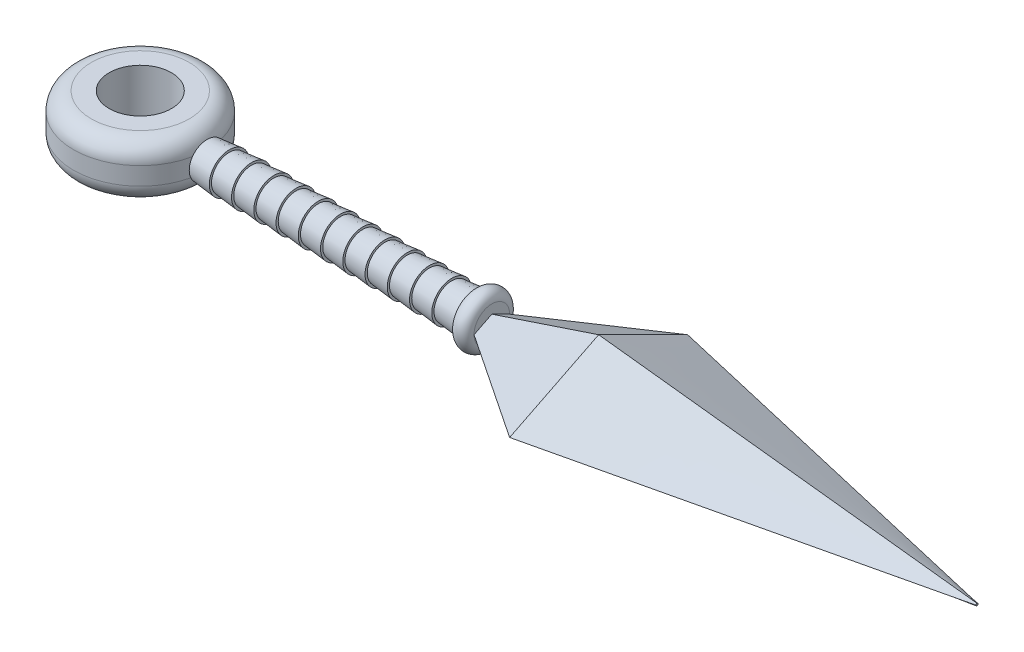
ISO-10303-21;
HEADER;
FILE_DESCRIPTION(('STEP AP214'),'2;1');
FILE_NAME('part.step','',(''),(''),'','','');
FILE_SCHEMA(('AUTOMOTIVE_DESIGN { 1 0 10303 214 1 1 1 1 }'));
ENDSEC;
DATA;
#1=APPLICATION_CONTEXT('core data for automotive mechanical design processes');
#2=APPLICATION_PROTOCOL_DEFINITION('international standard','automotive_design',2000,#1);
#3=PRODUCT_CONTEXT('',#1,'mechanical');
#4=PRODUCT('Part','Part','',(#3));
#5=PRODUCT_RELATED_PRODUCT_CATEGORY('part','',(#4));
#6=PRODUCT_DEFINITION_FORMATION('','',#4);
#7=PRODUCT_DEFINITION_CONTEXT('part definition',#1,'design');
#8=PRODUCT_DEFINITION('design','',#6,#7);
#9=PRODUCT_DEFINITION_SHAPE('','',#8);
#10=(LENGTH_UNIT() NAMED_UNIT(*) SI_UNIT(.MILLI.,.METRE.));
#11=(NAMED_UNIT(*) PLANE_ANGLE_UNIT() SI_UNIT($,.RADIAN.));
#12=(NAMED_UNIT(*) SI_UNIT($,.STERADIAN.) SOLID_ANGLE_UNIT());
#13=UNCERTAINTY_MEASURE_WITH_UNIT(LENGTH_MEASURE(1.E-05),#10,'distance_accuracy_value','');
#14=(GEOMETRIC_REPRESENTATION_CONTEXT(3) GLOBAL_UNCERTAINTY_ASSIGNED_CONTEXT((#13)) GLOBAL_UNIT_ASSIGNED_CONTEXT((#10,
#11,#12)) REPRESENTATION_CONTEXT('',''));
#15=CARTESIAN_POINT('',(0.,0.,0.));
#16=DIRECTION('',(0.,0.,1.));
#17=DIRECTION('',(1.,0.,0.));
#18=AXIS2_PLACEMENT_3D('',#15,#16,#17);
#19=CARTESIAN_POINT('',(75.,0.,0.));
#20=DIRECTION('',(-1.,0.,0.));
#21=DIRECTION('',(0.,0.,1.));
#22=AXIS2_PLACEMENT_3D('',#19,#20,#21);
#23=PLANE('',#22);
#24=CARTESIAN_POINT('',(75.,0.,0.));
#25=DIRECTION('',(-1.,0.,0.));
#26=DIRECTION('',(0.,0.,1.));
#27=AXIS2_PLACEMENT_3D('',#24,#25,#26);
#28=CIRCLE('',#27,4.5);
#29=CARTESIAN_POINT('',(75.,0.,4.5));
#30=VERTEX_POINT('',#29);
#31=EDGE_CURVE('E12',#30,#30,#28,.T.);
#32=ORIENTED_EDGE('',*,*,#31,.F.);
#33=EDGE_LOOP('',(#32));
#34=FACE_BOUND('',#33,.T.);
#35=ADVANCED_FACE('F81',(#34),#23,.F.);
#36=CARTESIAN_POINT('',(75.,0.,0.));
#37=DIRECTION('',(1.,0.,0.));
#38=DIRECTION('',(0.,0.,-1.));
#39=AXIS2_PLACEMENT_3D('',#36,#37,#38);
#40=CONICAL_SURFACE('',#39,4.5,0.0996686524911619);
#41=CARTESIAN_POINT('',(70.,0.,0.));
#42=DIRECTION('',(-1.,0.,0.));
#43=DIRECTION('',(0.,0.,1.));
#44=AXIS2_PLACEMENT_3D('',#41,#42,#43);
#45=CIRCLE('',#44,4.);
#46=CARTESIAN_POINT('',(70.,0.,4.));
#47=VERTEX_POINT('',#46);
#48=EDGE_CURVE('E89',#47,#47,#45,.T.);
#49=ORIENTED_EDGE('',*,*,#48,.F.);
#50=EDGE_LOOP('',(#49));
#51=FACE_BOUND('',#50,.T.);
#52=ORIENTED_EDGE('',*,*,#31,.T.);
#53=EDGE_LOOP('',(#52));
#54=FACE_BOUND('',#53,.T.);
#55=ADVANCED_FACE('F98',(#51,#54),#40,.T.);
#56=CARTESIAN_POINT('',(70.,4.,0.));
#57=DIRECTION('',(1.,0.,0.));
#58=DIRECTION('',(0.,0.,-1.));
#59=AXIS2_PLACEMENT_3D('',#56,#57,#58);
#60=PLANE('',#59);
#61=ORIENTED_EDGE('',*,*,#48,.T.);
#62=EDGE_LOOP('',(#61));
#63=FACE_BOUND('',#62,.T.);
#64=ADVANCED_FACE('F96',(#63),#60,.F.);
#65=CLOSED_SHELL('',(#35,#55,#64));
#66=MANIFOLD_SOLID_BREP('B2',#65);
#67=CARTESIAN_POINT('',(70.,0.,0.));
#68=DIRECTION('',(-1.,0.,0.));
#69=DIRECTION('',(0.,0.,1.));
#70=AXIS2_PLACEMENT_3D('',#67,#68,#69);
#71=PLANE('',#70);
#72=CARTESIAN_POINT('',(70.,0.,0.));
#73=DIRECTION('',(-1.,0.,0.));
#74=DIRECTION('',(0.,0.,1.));
#75=AXIS2_PLACEMENT_3D('',#72,#73,#74);
#76=CIRCLE('',#75,4.5);
#77=CARTESIAN_POINT('',(70.,0.,4.5));
#78=VERTEX_POINT('',#77);
#79=EDGE_CURVE('E85',#78,#78,#76,.T.);
#80=ORIENTED_EDGE('',*,*,#79,.F.);
#81=EDGE_LOOP('',(#80));
#82=FACE_BOUND('',#81,.T.);
#83=ADVANCED_FACE('F132',(#82),#71,.F.);
#84=CARTESIAN_POINT('',(70.,0.,0.));
#85=DIRECTION('',(1.,0.,0.));
#86=DIRECTION('',(0.,0.,-1.));
#87=AXIS2_PLACEMENT_3D('',#84,#85,#86);
#88=CONICAL_SURFACE('',#87,4.5,0.0996686524911619);
#89=CARTESIAN_POINT('',(65.,0.,0.));
#90=DIRECTION('',(-1.,0.,0.));
#91=DIRECTION('',(0.,0.,1.));
#92=AXIS2_PLACEMENT_3D('',#89,#90,#91);
#93=CIRCLE('',#92,4.);
#94=CARTESIAN_POINT('',(65.,0.,4.));
#95=VERTEX_POINT('',#94);
#96=EDGE_CURVE('E136',#95,#95,#93,.T.);
#97=ORIENTED_EDGE('',*,*,#96,.F.);
#98=EDGE_LOOP('',(#97));
#99=FACE_BOUND('',#98,.T.);
#100=ORIENTED_EDGE('',*,*,#79,.T.);
#101=EDGE_LOOP('',(#100));
#102=FACE_BOUND('',#101,.T.);
#103=ADVANCED_FACE('F150',(#99,#102),#88,.T.);
#104=CARTESIAN_POINT('',(65.,4.,0.));
#105=DIRECTION('',(1.,0.,0.));
#106=DIRECTION('',(0.,0.,-1.));
#107=AXIS2_PLACEMENT_3D('',#104,#105,#106);
#108=PLANE('',#107);
#109=ORIENTED_EDGE('',*,*,#96,.T.);
#110=EDGE_LOOP('',(#109));
#111=FACE_BOUND('',#110,.T.);
#112=ADVANCED_FACE('F144',(#111),#108,.F.);
#113=CLOSED_SHELL('',(#83,#103,#112));
#114=MANIFOLD_SOLID_BREP('B7',#113);
#115=CARTESIAN_POINT('',(65.,0.,0.));
#116=DIRECTION('',(-1.,0.,0.));
#117=DIRECTION('',(0.,0.,1.));
#118=AXIS2_PLACEMENT_3D('',#115,#116,#117);
#119=PLANE('',#118);
#120=CARTESIAN_POINT('',(65.,0.,0.));
#121=DIRECTION('',(-1.,0.,0.));
#122=DIRECTION('',(0.,0.,1.));
#123=AXIS2_PLACEMENT_3D('',#120,#121,#122);
#124=CIRCLE('',#123,4.5);
#125=CARTESIAN_POINT('',(65.,0.,4.5));
#126=VERTEX_POINT('',#125);
#127=EDGE_CURVE('E134',#126,#126,#124,.T.);
#128=ORIENTED_EDGE('',*,*,#127,.F.);
#129=EDGE_LOOP('',(#128));
#130=FACE_BOUND('',#129,.T.);
#131=ADVANCED_FACE('F185',(#130),#119,.F.);
#132=CARTESIAN_POINT('',(65.,0.,0.));
#133=DIRECTION('',(1.,0.,0.));
#134=DIRECTION('',(0.,0.,-1.));
#135=AXIS2_PLACEMENT_3D('',#132,#133,#134);
#136=CONICAL_SURFACE('',#135,4.5,0.0996686524911619);
#137=CARTESIAN_POINT('',(60.,0.,0.));
#138=DIRECTION('',(-1.,0.,0.));
#139=DIRECTION('',(0.,0.,1.));
#140=AXIS2_PLACEMENT_3D('',#137,#138,#139);
#141=CIRCLE('',#140,4.);
#142=CARTESIAN_POINT('',(60.,0.,4.));
#143=VERTEX_POINT('',#142);
#144=EDGE_CURVE('E187',#143,#143,#141,.T.);
#145=ORIENTED_EDGE('',*,*,#144,.F.);
#146=EDGE_LOOP('',(#145));
#147=FACE_BOUND('',#146,.T.);
#148=ORIENTED_EDGE('',*,*,#127,.T.);
#149=EDGE_LOOP('',(#148));
#150=FACE_BOUND('',#149,.T.);
#151=ADVANCED_FACE('F198',(#147,#150),#136,.T.);
#152=CARTESIAN_POINT('',(60.,4.,0.));
#153=DIRECTION('',(1.,0.,0.));
#154=DIRECTION('',(0.,0.,-1.));
#155=AXIS2_PLACEMENT_3D('',#152,#153,#154);
#156=PLANE('',#155);
#157=ORIENTED_EDGE('',*,*,#144,.T.);
#158=EDGE_LOOP('',(#157));
#159=FACE_BOUND('',#158,.T.);
#160=ADVANCED_FACE('F191',(#159),#156,.F.);
#161=CLOSED_SHELL('',(#131,#151,#160));
#162=MANIFOLD_SOLID_BREP('B77',#161);
#163=CARTESIAN_POINT('',(60.,0.,0.));
#164=DIRECTION('',(-1.,0.,0.));
#165=DIRECTION('',(0.,0.,1.));
#166=AXIS2_PLACEMENT_3D('',#163,#164,#165);
#167=PLANE('',#166);
#168=CARTESIAN_POINT('',(60.,0.,0.));
#169=DIRECTION('',(-1.,0.,0.));
#170=DIRECTION('',(0.,0.,1.));
#171=AXIS2_PLACEMENT_3D('',#168,#169,#170);
#172=CIRCLE('',#171,4.5);
#173=CARTESIAN_POINT('',(60.,0.,4.5));
#174=VERTEX_POINT('',#173);
#175=EDGE_CURVE('E182',#174,#174,#172,.T.);
#176=ORIENTED_EDGE('',*,*,#175,.F.);
#177=EDGE_LOOP('',(#176));
#178=FACE_BOUND('',#177,.T.);
#179=ADVANCED_FACE('F232',(#178),#167,.F.);
#180=CARTESIAN_POINT('',(60.,0.,0.));
#181=DIRECTION('',(1.,0.,0.));
#182=DIRECTION('',(0.,0.,-1.));
#183=AXIS2_PLACEMENT_3D('',#180,#181,#182);
#184=CONICAL_SURFACE('',#183,4.5,0.0996686524911619);
#185=CARTESIAN_POINT('',(55.,0.,0.));
#186=DIRECTION('',(-1.,0.,0.));
#187=DIRECTION('',(0.,0.,1.));
#188=AXIS2_PLACEMENT_3D('',#185,#186,#187);
#189=CIRCLE('',#188,4.);
#190=CARTESIAN_POINT('',(55.,0.,4.));
#191=VERTEX_POINT('',#190);
#192=EDGE_CURVE('E240',#191,#191,#189,.T.);
#193=ORIENTED_EDGE('',*,*,#192,.F.);
#194=EDGE_LOOP('',(#193));
#195=FACE_BOUND('',#194,.T.);
#196=ORIENTED_EDGE('',*,*,#175,.T.);
#197=EDGE_LOOP('',(#196));
#198=FACE_BOUND('',#197,.T.);
#199=ADVANCED_FACE('F241',(#195,#198),#184,.T.);
#200=CARTESIAN_POINT('',(55.,4.,0.));
#201=DIRECTION('',(1.,0.,0.));
#202=DIRECTION('',(0.,0.,-1.));
#203=AXIS2_PLACEMENT_3D('',#200,#201,#202);
#204=PLANE('',#203);
#205=ORIENTED_EDGE('',*,*,#192,.T.);
#206=EDGE_LOOP('',(#205));
#207=FACE_BOUND('',#206,.T.);
#208=ADVANCED_FACE('F242',(#207),#204,.F.);
#209=CLOSED_SHELL('',(#179,#199,#208));
#210=MANIFOLD_SOLID_BREP('B130',#209);
#211=CARTESIAN_POINT('',(55.,0.,0.));
#212=DIRECTION('',(-1.,0.,0.));
#213=DIRECTION('',(0.,0.,1.));
#214=AXIS2_PLACEMENT_3D('',#211,#212,#213);
#215=PLANE('',#214);
#216=CARTESIAN_POINT('',(55.,0.,0.));
#217=DIRECTION('',(-1.,0.,0.));
#218=DIRECTION('',(0.,0.,1.));
#219=AXIS2_PLACEMENT_3D('',#216,#217,#218);
#220=CIRCLE('',#219,4.5);
#221=CARTESIAN_POINT('',(55.,0.,4.5));
#222=VERTEX_POINT('',#221);
#223=EDGE_CURVE('E226',#222,#222,#220,.T.);
#224=ORIENTED_EDGE('',*,*,#223,.F.);
#225=EDGE_LOOP('',(#224));
#226=FACE_BOUND('',#225,.T.);
#227=ADVANCED_FACE('F278',(#226),#215,.F.);
#228=CARTESIAN_POINT('',(55.,0.,0.));
#229=DIRECTION('',(1.,0.,0.));
#230=DIRECTION('',(0.,0.,-1.));
#231=AXIS2_PLACEMENT_3D('',#228,#229,#230);
#232=CONICAL_SURFACE('',#231,4.5,0.0996686524911619);
#233=CARTESIAN_POINT('',(50.,0.,0.));
#234=DIRECTION('',(-1.,0.,0.));
#235=DIRECTION('',(0.,0.,1.));
#236=AXIS2_PLACEMENT_3D('',#233,#234,#235);
#237=CIRCLE('',#236,4.);
#238=CARTESIAN_POINT('',(50.,0.,4.));
#239=VERTEX_POINT('',#238);
#240=EDGE_CURVE('E287',#239,#239,#237,.T.);
#241=ORIENTED_EDGE('',*,*,#240,.F.);
#242=EDGE_LOOP('',(#241));
#243=FACE_BOUND('',#242,.T.);
#244=ORIENTED_EDGE('',*,*,#223,.T.);
#245=EDGE_LOOP('',(#244));
#246=FACE_BOUND('',#245,.T.);
#247=ADVANCED_FACE('F294',(#243,#246),#232,.T.);
#248=CARTESIAN_POINT('',(50.,4.,0.));
#249=DIRECTION('',(1.,0.,0.));
#250=DIRECTION('',(0.,0.,-1.));
#251=AXIS2_PLACEMENT_3D('',#248,#249,#250);
#252=PLANE('',#251);
#253=ORIENTED_EDGE('',*,*,#240,.T.);
#254=EDGE_LOOP('',(#253));
#255=FACE_BOUND('',#254,.T.);
#256=ADVANCED_FACE('F295',(#255),#252,.F.);
#257=CLOSED_SHELL('',(#227,#247,#256));
#258=MANIFOLD_SOLID_BREP('B177',#257);
#259=CARTESIAN_POINT('',(50.,0.,0.));
#260=DIRECTION('',(-1.,0.,0.));
#261=DIRECTION('',(0.,0.,1.));
#262=AXIS2_PLACEMENT_3D('',#259,#260,#261);
#263=PLANE('',#262);
#264=CARTESIAN_POINT('',(50.,0.,0.));
#265=DIRECTION('',(-1.,0.,0.));
#266=DIRECTION('',(0.,0.,1.));
#267=AXIS2_PLACEMENT_3D('',#264,#265,#266);
#268=CIRCLE('',#267,4.5);
#269=CARTESIAN_POINT('',(50.,0.,4.5));
#270=VERTEX_POINT('',#269);
#271=EDGE_CURVE('E276',#270,#270,#268,.T.);
#272=ORIENTED_EDGE('',*,*,#271,.F.);
#273=EDGE_LOOP('',(#272));
#274=FACE_BOUND('',#273,.T.);
#275=ADVANCED_FACE('F328',(#274),#263,.F.);
#276=CARTESIAN_POINT('',(50.,0.,0.));
#277=DIRECTION('',(1.,0.,0.));
#278=DIRECTION('',(0.,0.,-1.));
#279=AXIS2_PLACEMENT_3D('',#276,#277,#278);
#280=CONICAL_SURFACE('',#279,4.5,0.0996686524911619);
#281=CARTESIAN_POINT('',(45.,0.,0.));
#282=DIRECTION('',(-1.,0.,0.));
#283=DIRECTION('',(0.,0.,1.));
#284=AXIS2_PLACEMENT_3D('',#281,#282,#283);
#285=CIRCLE('',#284,4.);
#286=CARTESIAN_POINT('',(45.,0.,4.));
#287=VERTEX_POINT('',#286);
#288=EDGE_CURVE('E333',#287,#287,#285,.T.);
#289=ORIENTED_EDGE('',*,*,#288,.F.);
#290=EDGE_LOOP('',(#289));
#291=FACE_BOUND('',#290,.T.);
#292=ORIENTED_EDGE('',*,*,#271,.T.);
#293=EDGE_LOOP('',(#292));
#294=FACE_BOUND('',#293,.T.);
#295=ADVANCED_FACE('F345',(#291,#294),#280,.T.);
#296=CARTESIAN_POINT('',(45.,4.,0.));
#297=DIRECTION('',(1.,0.,0.));
#298=DIRECTION('',(0.,0.,-1.));
#299=AXIS2_PLACEMENT_3D('',#296,#297,#298);
#300=PLANE('',#299);
#301=ORIENTED_EDGE('',*,*,#288,.T.);
#302=EDGE_LOOP('',(#301));
#303=FACE_BOUND('',#302,.T.);
#304=ADVANCED_FACE('F342',(#303),#300,.F.);
#305=CLOSED_SHELL('',(#275,#295,#304));
#306=MANIFOLD_SOLID_BREP('B223',#305);
#307=CARTESIAN_POINT('',(45.,0.,0.));
#308=DIRECTION('',(-1.,0.,0.));
#309=DIRECTION('',(0.,0.,1.));
#310=AXIS2_PLACEMENT_3D('',#307,#308,#309);
#311=PLANE('',#310);
#312=CARTESIAN_POINT('',(45.,0.,0.));
#313=DIRECTION('',(-1.,0.,0.));
#314=DIRECTION('',(0.,0.,1.));
#315=AXIS2_PLACEMENT_3D('',#312,#313,#314);
#316=CIRCLE('',#315,4.5);
#317=CARTESIAN_POINT('',(45.,0.,4.5));
#318=VERTEX_POINT('',#317);
#319=EDGE_CURVE('E327',#318,#318,#316,.T.);
#320=ORIENTED_EDGE('',*,*,#319,.F.);
#321=EDGE_LOOP('',(#320));
#322=FACE_BOUND('',#321,.T.);
#323=ADVANCED_FACE('F378',(#322),#311,.F.);
#324=CARTESIAN_POINT('',(45.,0.,0.));
#325=DIRECTION('',(1.,0.,0.));
#326=DIRECTION('',(0.,0.,-1.));
#327=AXIS2_PLACEMENT_3D('',#324,#325,#326);
#328=CONICAL_SURFACE('',#327,4.5,0.0996686524911619);
#329=CARTESIAN_POINT('',(40.,0.,0.));
#330=DIRECTION('',(-1.,0.,0.));
#331=DIRECTION('',(0.,0.,1.));
#332=AXIS2_PLACEMENT_3D('',#329,#330,#331);
#333=CIRCLE('',#332,4.);
#334=CARTESIAN_POINT('',(40.,0.,4.));
#335=VERTEX_POINT('',#334);
#336=EDGE_CURVE('E383',#335,#335,#333,.T.);
#337=ORIENTED_EDGE('',*,*,#336,.F.);
#338=EDGE_LOOP('',(#337));
#339=FACE_BOUND('',#338,.T.);
#340=ORIENTED_EDGE('',*,*,#319,.T.);
#341=EDGE_LOOP('',(#340));
#342=FACE_BOUND('',#341,.T.);
#343=ADVANCED_FACE('F394',(#339,#342),#328,.T.);
#344=CARTESIAN_POINT('',(40.,4.,0.));
#345=DIRECTION('',(1.,0.,0.));
#346=DIRECTION('',(0.,0.,-1.));
#347=AXIS2_PLACEMENT_3D('',#344,#345,#346);
#348=PLANE('',#347);
#349=ORIENTED_EDGE('',*,*,#336,.T.);
#350=EDGE_LOOP('',(#349));
#351=FACE_BOUND('',#350,.T.);
#352=ADVANCED_FACE('F388',(#351),#348,.F.);
#353=CLOSED_SHELL('',(#323,#343,#352));
#354=MANIFOLD_SOLID_BREP('B273',#353);
#355=CARTESIAN_POINT('',(40.,0.,0.));
#356=DIRECTION('',(-1.,0.,0.));
#357=DIRECTION('',(0.,0.,1.));
#358=AXIS2_PLACEMENT_3D('',#355,#356,#357);
#359=PLANE('',#358);
#360=CARTESIAN_POINT('',(40.,0.,0.));
#361=DIRECTION('',(-1.,0.,0.));
#362=DIRECTION('',(0.,0.,1.));
#363=AXIS2_PLACEMENT_3D('',#360,#361,#362);
#364=CIRCLE('',#363,4.5);
#365=CARTESIAN_POINT('',(40.,0.,4.5));
#366=VERTEX_POINT('',#365);
#367=EDGE_CURVE('E380',#366,#366,#364,.T.);
#368=ORIENTED_EDGE('',*,*,#367,.F.);
#369=EDGE_LOOP('',(#368));
#370=FACE_BOUND('',#369,.T.);
#371=ADVANCED_FACE('F430',(#370),#359,.F.);
#372=CARTESIAN_POINT('',(40.,0.,0.));
#373=DIRECTION('',(1.,0.,0.));
#374=DIRECTION('',(0.,0.,-1.));
#375=AXIS2_PLACEMENT_3D('',#372,#373,#374);
#376=CONICAL_SURFACE('',#375,4.5,0.0996686524911619);
#377=CARTESIAN_POINT('',(35.,0.,0.));
#378=DIRECTION('',(-1.,0.,0.));
#379=DIRECTION('',(0.,0.,1.));
#380=AXIS2_PLACEMENT_3D('',#377,#378,#379);
#381=CIRCLE('',#380,4.);
#382=CARTESIAN_POINT('',(35.,0.,4.));
#383=VERTEX_POINT('',#382);
#384=EDGE_CURVE('E433',#383,#383,#381,.T.);
#385=ORIENTED_EDGE('',*,*,#384,.F.);
#386=EDGE_LOOP('',(#385));
#387=FACE_BOUND('',#386,.T.);
#388=ORIENTED_EDGE('',*,*,#367,.T.);
#389=EDGE_LOOP('',(#388));
#390=FACE_BOUND('',#389,.T.);
#391=ADVANCED_FACE('F442',(#387,#390),#376,.T.);
#392=CARTESIAN_POINT('',(35.,4.,0.));
#393=DIRECTION('',(1.,0.,0.));
#394=DIRECTION('',(0.,0.,-1.));
#395=AXIS2_PLACEMENT_3D('',#392,#393,#394);
#396=PLANE('',#395);
#397=ORIENTED_EDGE('',*,*,#384,.T.);
#398=EDGE_LOOP('',(#397));
#399=FACE_BOUND('',#398,.T.);
#400=ADVANCED_FACE('F438',(#399),#396,.F.);
#401=CLOSED_SHELL('',(#371,#391,#400));
#402=MANIFOLD_SOLID_BREP('B323',#401);
#403=CARTESIAN_POINT('',(35.,0.,0.));
#404=DIRECTION('',(-1.,0.,0.));
#405=DIRECTION('',(0.,0.,1.));
#406=AXIS2_PLACEMENT_3D('',#403,#404,#405);
#407=PLANE('',#406);
#408=CARTESIAN_POINT('',(35.,0.,0.));
#409=DIRECTION('',(-1.,0.,0.));
#410=DIRECTION('',(0.,0.,1.));
#411=AXIS2_PLACEMENT_3D('',#408,#409,#410);
#412=CIRCLE('',#411,4.5);
#413=CARTESIAN_POINT('',(35.,0.,4.5));
#414=VERTEX_POINT('',#413);
#415=EDGE_CURVE('E426',#414,#414,#412,.T.);
#416=ORIENTED_EDGE('',*,*,#415,.F.);
#417=EDGE_LOOP('',(#416));
#418=FACE_BOUND('',#417,.T.);
#419=ADVANCED_FACE('F478',(#418),#407,.F.);
#420=CARTESIAN_POINT('',(35.,0.,0.));
#421=DIRECTION('',(1.,0.,0.));
#422=DIRECTION('',(0.,0.,-1.));
#423=AXIS2_PLACEMENT_3D('',#420,#421,#422);
#424=CONICAL_SURFACE('',#423,4.5,0.0996686524911619);
#425=CARTESIAN_POINT('',(30.,0.,0.));
#426=DIRECTION('',(-1.,0.,0.));
#427=DIRECTION('',(0.,0.,1.));
#428=AXIS2_PLACEMENT_3D('',#425,#426,#427);
#429=CIRCLE('',#428,4.);
#430=CARTESIAN_POINT('',(30.,0.,4.));
#431=VERTEX_POINT('',#430);
#432=EDGE_CURVE('E485',#431,#431,#429,.T.);
#433=ORIENTED_EDGE('',*,*,#432,.F.);
#434=EDGE_LOOP('',(#433));
#435=FACE_BOUND('',#434,.T.);
#436=ORIENTED_EDGE('',*,*,#415,.T.);
#437=EDGE_LOOP('',(#436));
#438=FACE_BOUND('',#437,.T.);
#439=ADVANCED_FACE('F489',(#435,#438),#424,.T.);
#440=CARTESIAN_POINT('',(30.,4.,0.));
#441=DIRECTION('',(1.,0.,0.));
#442=DIRECTION('',(0.,0.,-1.));
#443=AXIS2_PLACEMENT_3D('',#440,#441,#442);
#444=PLANE('',#443);
#445=ORIENTED_EDGE('',*,*,#432,.T.);
#446=EDGE_LOOP('',(#445));
#447=FACE_BOUND('',#446,.T.);
#448=ADVANCED_FACE('F488',(#447),#444,.F.);
#449=CLOSED_SHELL('',(#419,#439,#448));
#450=MANIFOLD_SOLID_BREP('B375',#449);
#451=CARTESIAN_POINT('',(30.,0.,0.));
#452=DIRECTION('',(-1.,0.,0.));
#453=DIRECTION('',(0.,0.,1.));
#454=AXIS2_PLACEMENT_3D('',#451,#452,#453);
#455=PLANE('',#454);
#456=CARTESIAN_POINT('',(30.,0.,0.));
#457=DIRECTION('',(-1.,0.,0.));
#458=DIRECTION('',(0.,0.,1.));
#459=AXIS2_PLACEMENT_3D('',#456,#457,#458);
#460=CIRCLE('',#459,4.5);
#461=CARTESIAN_POINT('',(30.,0.,4.5));
#462=VERTEX_POINT('',#461);
#463=EDGE_CURVE('E474',#462,#462,#460,.T.);
#464=ORIENTED_EDGE('',*,*,#463,.F.);
#465=EDGE_LOOP('',(#464));
#466=FACE_BOUND('',#465,.T.);
#467=ADVANCED_FACE('F523',(#466),#455,.F.);
#468=CARTESIAN_POINT('',(30.,0.,0.));
#469=DIRECTION('',(1.,0.,0.));
#470=DIRECTION('',(0.,0.,-1.));
#471=AXIS2_PLACEMENT_3D('',#468,#469,#470);
#472=CONICAL_SURFACE('',#471,4.5,0.0996686524911619);
#473=CARTESIAN_POINT('',(25.,0.,0.));
#474=DIRECTION('',(-1.,0.,0.));
#475=DIRECTION('',(0.,0.,1.));
#476=AXIS2_PLACEMENT_3D('',#473,#474,#475);
#477=CIRCLE('',#476,4.);
#478=CARTESIAN_POINT('',(25.,0.,4.));
#479=VERTEX_POINT('',#478);
#480=EDGE_CURVE('E533',#479,#479,#477,.T.);
#481=ORIENTED_EDGE('',*,*,#480,.F.);
#482=EDGE_LOOP('',(#481));
#483=FACE_BOUND('',#482,.T.);
#484=ORIENTED_EDGE('',*,*,#463,.T.);
#485=EDGE_LOOP('',(#484));
#486=FACE_BOUND('',#485,.T.);
#487=ADVANCED_FACE('F537',(#483,#486),#472,.T.);
#488=CARTESIAN_POINT('',(25.,4.,0.));
#489=DIRECTION('',(1.,0.,0.));
#490=DIRECTION('',(0.,0.,-1.));
#491=AXIS2_PLACEMENT_3D('',#488,#489,#490);
#492=PLANE('',#491);
#493=ORIENTED_EDGE('',*,*,#480,.T.);
#494=EDGE_LOOP('',(#493));
#495=FACE_BOUND('',#494,.T.);
#496=ADVANCED_FACE('F540',(#495),#492,.F.);
#497=CLOSED_SHELL('',(#467,#487,#496));
#498=MANIFOLD_SOLID_BREP('B423',#497);
#499=CARTESIAN_POINT('',(25.,0.,0.));
#500=DIRECTION('',(-1.,0.,0.));
#501=DIRECTION('',(0.,0.,1.));
#502=AXIS2_PLACEMENT_3D('',#499,#500,#501);
#503=PLANE('',#502);
#504=CARTESIAN_POINT('',(25.,0.,0.));
#505=DIRECTION('',(-1.,0.,0.));
#506=DIRECTION('',(0.,0.,1.));
#507=AXIS2_PLACEMENT_3D('',#504,#505,#506);
#508=CIRCLE('',#507,4.5);
#509=CARTESIAN_POINT('',(25.,0.,4.5));
#510=VERTEX_POINT('',#509);
#511=EDGE_CURVE('E521',#510,#510,#508,.T.);
#512=ORIENTED_EDGE('',*,*,#511,.F.);
#513=EDGE_LOOP('',(#512));
#514=FACE_BOUND('',#513,.T.);
#515=ADVANCED_FACE('F575',(#514),#503,.F.);
#516=CARTESIAN_POINT('',(25.,0.,0.));
#517=DIRECTION('',(1.,0.,0.));
#518=DIRECTION('',(0.,0.,-1.));
#519=AXIS2_PLACEMENT_3D('',#516,#517,#518);
#520=CONICAL_SURFACE('',#519,4.5,0.0996686524911619);
#521=CARTESIAN_POINT('',(20.,0.,0.));
#522=DIRECTION('',(-1.,0.,0.));
#523=DIRECTION('',(0.,0.,1.));
#524=AXIS2_PLACEMENT_3D('',#521,#522,#523);
#525=CIRCLE('',#524,4.);
#526=CARTESIAN_POINT('',(20.,0.,4.));
#527=VERTEX_POINT('',#526);
#528=EDGE_CURVE('E578',#527,#527,#525,.T.);
#529=ORIENTED_EDGE('',*,*,#528,.F.);
#530=EDGE_LOOP('',(#529));
#531=FACE_BOUND('',#530,.T.);
#532=ORIENTED_EDGE('',*,*,#511,.T.);
#533=EDGE_LOOP('',(#532));
#534=FACE_BOUND('',#533,.T.);
#535=ADVANCED_FACE('F586',(#531,#534),#520,.T.);
#536=CARTESIAN_POINT('',(20.,4.,0.));
#537=DIRECTION('',(1.,0.,0.));
#538=DIRECTION('',(0.,0.,-1.));
#539=AXIS2_PLACEMENT_3D('',#536,#537,#538);
#540=PLANE('',#539);
#541=ORIENTED_EDGE('',*,*,#528,.T.);
#542=EDGE_LOOP('',(#541));
#543=FACE_BOUND('',#542,.T.);
#544=ADVANCED_FACE('F588',(#543),#540,.F.);
#545=CLOSED_SHELL('',(#515,#535,#544));
#546=MANIFOLD_SOLID_BREP('B468',#545);
#547=CARTESIAN_POINT('',(20.,0.,0.));
#548=DIRECTION('',(-1.,0.,0.));
#549=DIRECTION('',(0.,0.,1.));
#550=AXIS2_PLACEMENT_3D('',#547,#548,#549);
#551=PLANE('',#550);
#552=CARTESIAN_POINT('',(20.,0.,0.));
#553=DIRECTION('',(-1.,0.,0.));
#554=DIRECTION('',(0.,0.,1.));
#555=AXIS2_PLACEMENT_3D('',#552,#553,#554);
#556=CIRCLE('',#555,4.5);
#557=CARTESIAN_POINT('',(20.,0.,4.5));
#558=VERTEX_POINT('',#557);
#559=EDGE_CURVE('E572',#558,#558,#556,.T.);
#560=ORIENTED_EDGE('',*,*,#559,.F.);
#561=EDGE_LOOP('',(#560));
#562=FACE_BOUND('',#561,.T.);
#563=ADVANCED_FACE('F623',(#562),#551,.F.);
#564=CARTESIAN_POINT('',(20.,0.,0.));
#565=DIRECTION('',(1.,0.,0.));
#566=DIRECTION('',(0.,0.,-1.));
#567=AXIS2_PLACEMENT_3D('',#564,#565,#566);
#568=CONICAL_SURFACE('',#567,4.5,0.0996686524911619);
#569=CARTESIAN_POINT('',(15.,0.,0.));
#570=DIRECTION('',(-1.,0.,0.));
#571=DIRECTION('',(0.,0.,1.));
#572=AXIS2_PLACEMENT_3D('',#569,#570,#571);
#573=CIRCLE('',#572,4.);
#574=CARTESIAN_POINT('',(15.,0.,4.));
#575=VERTEX_POINT('',#574);
#576=EDGE_CURVE('E632',#575,#575,#573,.T.);
#577=ORIENTED_EDGE('',*,*,#576,.F.);
#578=EDGE_LOOP('',(#577));
#579=FACE_BOUND('',#578,.T.);
#580=ORIENTED_EDGE('',*,*,#559,.T.);
#581=EDGE_LOOP('',(#580));
#582=FACE_BOUND('',#581,.T.);
#583=ADVANCED_FACE('F640',(#579,#582),#568,.T.);
#584=CARTESIAN_POINT('',(15.,4.,0.));
#585=DIRECTION('',(1.,0.,0.));
#586=DIRECTION('',(0.,0.,-1.));
#587=AXIS2_PLACEMENT_3D('',#584,#585,#586);
#588=PLANE('',#587);
#589=ORIENTED_EDGE('',*,*,#576,.T.);
#590=EDGE_LOOP('',(#589));
#591=FACE_BOUND('',#590,.T.);
#592=ADVANCED_FACE('F637',(#591),#588,.F.);
#593=CLOSED_SHELL('',(#563,#583,#592));
#594=MANIFOLD_SOLID_BREP('B520',#593);
#595=CARTESIAN_POINT('',(79.,4.,0.));
#596=DIRECTION('',(-1.,0.,0.));
#597=DIRECTION('',(0.,0.,1.));
#598=AXIS2_PLACEMENT_3D('',#595,#596,#597);
#599=PLANE('',#598);
#600=DIRECTION('',(0.,-0.447213595499958,0.894427190999916));
#601=VECTOR('',#600,1.);
#602=CARTESIAN_POINT('',(79.,2.,0.));
#603=LINE('',#602,#601);
#604=CARTESIAN_POINT('',(79.,2.,0.));
#605=VERTEX_POINT('',#604);
#606=CARTESIAN_POINT('',(79.,0.,4.));
#607=VERTEX_POINT('',#606);
#608=EDGE_CURVE('E894',#605,#607,#603,.T.);
#609=ORIENTED_EDGE('',*,*,#608,.F.);
#610=DIRECTION('',(0.,0.447213595499958,0.894427190999916));
#611=VECTOR('',#610,1.);
#612=CARTESIAN_POINT('',(79.,0.,-4.));
#613=LINE('',#612,#611);
#614=CARTESIAN_POINT('',(79.,0.,-4.));
#615=VERTEX_POINT('',#614);
#616=EDGE_CURVE('E837',#615,#605,#613,.T.);
#617=ORIENTED_EDGE('',*,*,#616,.F.);
#618=CARTESIAN_POINT('',(79.,0.,0.));
#619=DIRECTION('',(-1.,0.,0.));
#620=DIRECTION('',(0.,0.,1.));
#621=AXIS2_PLACEMENT_3D('',#618,#619,#620);
#622=CIRCLE('',#621,4.);
#623=EDGE_CURVE('E684',#607,#615,#622,.T.);
#624=ORIENTED_EDGE('',*,*,#623,.F.);
#625=EDGE_LOOP('',(#609,#617,#624));
#626=FACE_BOUND('',#625,.T.);
#627=ADVANCED_FACE('F675',(#626),#599,.F.);
#628=CARTESIAN_POINT('',(75.,0.,0.));
#629=DIRECTION('',(1.,0.,0.));
#630=DIRECTION('',(0.,0.,-1.));
#631=AXIS2_PLACEMENT_3D('',#628,#629,#630);
#632=PLANE('',#631);
#633=CARTESIAN_POINT('',(75.,0.,0.));
#634=DIRECTION('',(-1.,0.,0.));
#635=DIRECTION('',(0.,0.,1.));
#636=AXIS2_PLACEMENT_3D('',#633,#634,#635);
#637=CIRCLE('',#636,4.);
#638=CARTESIAN_POINT('',(75.,0.,4.));
#639=VERTEX_POINT('',#638);
#640=EDGE_CURVE('E621',#639,#639,#637,.T.);
#641=ORIENTED_EDGE('',*,*,#640,.T.);
#642=EDGE_LOOP('',(#641));
#643=FACE_BOUND('',#642,.T.);
#644=ADVANCED_FACE('F673',(#643),#632,.F.);
#645=CARTESIAN_POINT('',(77.,0.,0.));
#646=DIRECTION('',(-1.,0.,0.));
#647=DIRECTION('',(0.,0.,1.));
#648=AXIS2_PLACEMENT_3D('',#645,#646,#647);
#649=TOROIDAL_SURFACE('',#648,4.,2.);
#650=ORIENTED_EDGE('',*,*,#640,.F.);
#651=EDGE_LOOP('',(#650));
#652=FACE_BOUND('',#651,.T.);
#653=ORIENTED_EDGE('',*,*,#623,.T.);
#654=EDGE_CURVE('E905',#615,#607,#622,.T.);
#655=ORIENTED_EDGE('',*,*,#654,.T.);
#656=EDGE_LOOP('',(#653,#655));
#657=FACE_BOUND('',#656,.T.);
#658=ADVANCED_FACE('F874',(#652,#657),#649,.T.);
#659=ORIENTED_EDGE('',*,*,#654,.F.);
#660=DIRECTION('',(0.,0.447213595499958,-0.894427190999916));
#661=VECTOR('',#660,1.);
#662=CARTESIAN_POINT('',(79.,-2.,0.));
#663=LINE('',#662,#661);
#664=CARTESIAN_POINT('',(79.,-2.,0.));
#665=VERTEX_POINT('',#664);
#666=EDGE_CURVE('E899',#665,#615,#663,.T.);
#667=ORIENTED_EDGE('',*,*,#666,.F.);
#668=DIRECTION('',(0.,-0.447213595499958,-0.894427190999916));
#669=VECTOR('',#668,1.);
#670=CARTESIAN_POINT('',(79.,0.,4.));
#671=LINE('',#670,#669);
#672=EDGE_CURVE('E900',#607,#665,#671,.T.);
#673=ORIENTED_EDGE('',*,*,#672,.F.);
#674=EDGE_LOOP('',(#659,#667,#673));
#675=FACE_BOUND('',#674,.T.);
#676=ADVANCED_FACE('F864',(#675),#599,.F.);
#677=CARTESIAN_POINT('',(5.95918367346939,-17.8775510204082,8.93877551020408));
#678=DIRECTION('',(0.285714285714286,-0.857142857142857,0.428571428571429));
#679=DIRECTION('',(0.,-0.447213595499958,-0.894427190999916));
#680=AXIS2_PLACEMENT_3D('',#677,#678,#679);
#681=PLANE('',#680);
#682=DIRECTION('',(0.948683298050514,0.316227766016838,0.));
#683=VECTOR('',#682,1.);
#684=CARTESIAN_POINT('',(79.,2.,0.));
#685=LINE('',#684,#683);
#686=CARTESIAN_POINT('',(103.,10.,0.));
#687=VERTEX_POINT('',#686);
#688=EDGE_CURVE('E688',#605,#687,#685,.T.);
#689=ORIENTED_EDGE('',*,*,#688,.T.);
#690=DIRECTION('',(0.,0.447213595499958,0.894427190999916));
#691=VECTOR('',#690,1.);
#692=CARTESIAN_POINT('',(103.,0.,-20.));
#693=LINE('',#692,#691);
#694=CARTESIAN_POINT('',(103.,0.,-20.));
#695=VERTEX_POINT('',#694);
#696=EDGE_CURVE('E918',#695,#687,#693,.T.);
#697=ORIENTED_EDGE('',*,*,#696,.F.);
#698=DIRECTION('',(0.832050294337844,0.,-0.554700196225229));
#699=VECTOR('',#698,1.);
#700=CARTESIAN_POINT('',(79.,0.,-4.));
#701=LINE('',#700,#699);
#702=EDGE_CURVE('E928',#615,#695,#701,.T.);
#703=ORIENTED_EDGE('',*,*,#702,.F.);
#704=ORIENTED_EDGE('',*,*,#616,.T.);
#705=EDGE_LOOP('',(#689,#697,#703,#704));
#706=FACE_BOUND('',#705,.T.);
#707=ADVANCED_FACE('F853',(#706),#681,.F.);
#708=CARTESIAN_POINT('',(5.95918367346939,17.8775510204082,8.93877551020408));
#709=DIRECTION('',(0.285714285714286,0.857142857142857,0.428571428571429));
#710=DIRECTION('',(0.,-0.447213595499958,0.894427190999916));
#711=AXIS2_PLACEMENT_3D('',#708,#709,#710);
#712=PLANE('',#711);
#713=ORIENTED_EDGE('',*,*,#702,.T.);
#714=DIRECTION('',(0.,0.447213595499958,-0.894427190999916));
#715=VECTOR('',#714,1.);
#716=CARTESIAN_POINT('',(103.,-10.,0.));
#717=LINE('',#716,#715);
#718=CARTESIAN_POINT('',(103.,-10.,0.));
#719=VERTEX_POINT('',#718);
#720=EDGE_CURVE('E818',#719,#695,#717,.T.);
#721=ORIENTED_EDGE('',*,*,#720,.F.);
#722=DIRECTION('',(0.948683298050514,-0.316227766016838,0.));
#723=VECTOR('',#722,1.);
#724=CARTESIAN_POINT('',(79.,-2.,0.));
#725=LINE('',#724,#723);
#726=EDGE_CURVE('E696',#665,#719,#725,.T.);
#727=ORIENTED_EDGE('',*,*,#726,.F.);
#728=ORIENTED_EDGE('',*,*,#666,.T.);
#729=EDGE_LOOP('',(#713,#721,#727,#728));
#730=FACE_BOUND('',#729,.T.);
#731=ADVANCED_FACE('F861',(#730),#712,.F.);
#732=CARTESIAN_POINT('',(5.95918367346939,-17.8775510204082,-8.93877551020408));
#733=DIRECTION('',(0.285714285714286,-0.857142857142857,-0.428571428571429));
#734=DIRECTION('',(0.,0.447213595499958,-0.894427190999916));
#735=AXIS2_PLACEMENT_3D('',#732,#733,#734);
#736=PLANE('',#735);
#737=DIRECTION('',(0.832050294337844,0.,0.554700196225229));
#738=VECTOR('',#737,1.);
#739=CARTESIAN_POINT('',(79.,0.,4.));
#740=LINE('',#739,#738);
#741=CARTESIAN_POINT('',(103.,0.,20.));
#742=VERTEX_POINT('',#741);
#743=EDGE_CURVE('E926',#607,#742,#740,.T.);
#744=ORIENTED_EDGE('',*,*,#743,.T.);
#745=DIRECTION('',(0.,-0.447213595499958,0.894427190999916));
#746=VECTOR('',#745,1.);
#747=CARTESIAN_POINT('',(103.,10.,0.));
#748=LINE('',#747,#746);
#749=EDGE_CURVE('E739',#687,#742,#748,.T.);
#750=ORIENTED_EDGE('',*,*,#749,.F.);
#751=ORIENTED_EDGE('',*,*,#688,.F.);
#752=ORIENTED_EDGE('',*,*,#608,.T.);
#753=EDGE_LOOP('',(#744,#750,#751,#752));
#754=FACE_BOUND('',#753,.T.);
#755=ADVANCED_FACE('F868',(#754),#736,.F.);
#756=CARTESIAN_POINT('',(5.95918367346939,17.8775510204082,-8.93877551020408));
#757=DIRECTION('',(0.285714285714286,0.857142857142857,-0.428571428571429));
#758=DIRECTION('',(0.,0.447213595499958,0.894427190999916));
#759=AXIS2_PLACEMENT_3D('',#756,#757,#758);
#760=PLANE('',#759);
#761=ORIENTED_EDGE('',*,*,#726,.T.);
#762=DIRECTION('',(0.,-0.447213595499958,-0.894427190999916));
#763=VECTOR('',#762,1.);
#764=CARTESIAN_POINT('',(103.,0.,20.));
#765=LINE('',#764,#763);
#766=EDGE_CURVE('E921',#742,#719,#765,.T.);
#767=ORIENTED_EDGE('',*,*,#766,.F.);
#768=ORIENTED_EDGE('',*,*,#743,.F.);
#769=ORIENTED_EDGE('',*,*,#672,.T.);
#770=EDGE_LOOP('',(#761,#767,#768,#769));
#771=FACE_BOUND('',#770,.T.);
#772=ADVANCED_FACE('F776',(#771),#760,.F.);
#773=CARTESIAN_POINT('',(188.,0.,0.));
#774=DIRECTION('',(1.,0.,0.));
#775=DIRECTION('',(0.,0.,-1.));
#776=AXIS2_PLACEMENT_3D('',#773,#774,#775);
#777=PLANE('',#776);
#778=CARTESIAN_POINT('',(188.,0.,0.));
#779=DIRECTION('',(1.,0.,0.));
#780=DIRECTION('',(0.,0.,-1.));
#781=AXIS2_PLACEMENT_3D('',#778,#779,#780);
#782=CIRCLE('',#781,0.25);
#783=CARTESIAN_POINT('',(188.,0.,0.25));
#784=VERTEX_POINT('',#783);
#785=CARTESIAN_POINT('',(188.,-0.25,0.));
#786=VERTEX_POINT('',#785);
#787=EDGE_CURVE('E741',#784,#786,#782,.T.);
#788=ORIENTED_EDGE('',*,*,#787,.T.);
#789=CARTESIAN_POINT('',(188.,0.,-0.25));
#790=VERTEX_POINT('',#789);
#791=EDGE_CURVE('E755',#786,#790,#782,.T.);
#792=ORIENTED_EDGE('',*,*,#791,.T.);
#793=CARTESIAN_POINT('',(188.,0.25,0.));
#794=VERTEX_POINT('',#793);
#795=EDGE_CURVE('E757',#790,#794,#782,.T.);
#796=ORIENTED_EDGE('',*,*,#795,.T.);
#797=EDGE_CURVE('E734',#794,#784,#782,.T.);
#798=ORIENTED_EDGE('',*,*,#797,.T.);
#799=EDGE_LOOP('',(#788,#792,#796,#798));
#800=FACE_BOUND('',#799,.T.);
#801=ADVANCED_FACE('F760',(#800),#777,.T.);
#802=CARTESIAN_POINT('',(188.,0.,-0.25));
#803=CARTESIAN_POINT('',(103.,0.,-20.));
#804=CARTESIAN_POINT('',(188.,-0.058925565098879,-0.25));
#805=CARTESIAN_POINT('',(103.,-1.66666666666667,-16.6666666666667));
#806=CARTESIAN_POINT('',(188.,-0.127961158827728,-0.225592231765546));
#807=CARTESIAN_POINT('',(103.,-3.33333333333334,-13.3333333333333));
#808=CARTESIAN_POINT('',(188.,-0.225592231765545,-0.127961158827728));
#809=CARTESIAN_POINT('',(103.,-6.66666666666667,-6.66666666666666));
#810=CARTESIAN_POINT('',(188.,-0.25,-0.0589255650988789));
#811=CARTESIAN_POINT('',(103.,-8.33333333333334,-3.33333333333333));
#812=CARTESIAN_POINT('',(188.,-0.25,0.));
#813=CARTESIAN_POINT('',(103.,-10.,0.));
#814=B_SPLINE_SURFACE_WITH_KNOTS('',3,1,((#802,#803),(#804,#805),(#806,#807),(#808,#809),(#810,
#811),(#812,#813)),.UNSPECIFIED.,.F.,.F.,.F.,(4,2,4),(2,2),(0.,0.5,1.),(0.,1.),.UNSPECIFIED.);
#815=DIRECTION('',(-0.993485495895499,-0.113958630411543,0.));
#816=VECTOR('',#815,1.);
#817=CARTESIAN_POINT('',(145.5,-5.125,0.));
#818=LINE('',#817,#816);
#819=EDGE_CURVE('E742',#786,#719,#818,.T.);
#820=DIRECTION('',(0.97405210595179,0.,0.226323871677034));
#821=VECTOR('',#820,1.);
#822=CARTESIAN_POINT('',(145.5,0.,-10.125));
#823=LINE('',#822,#821);
#824=EDGE_CURVE('E753',#695,#790,#823,.T.);
#825=ORIENTED_EDGE('',*,*,#791,.F.);
#826=ORIENTED_EDGE('',*,*,#819,.T.);
#827=ORIENTED_EDGE('',*,*,#720,.T.);
#828=ORIENTED_EDGE('',*,*,#824,.T.);
#829=EDGE_LOOP('',(#825,#826,#827,#828));
#830=FACE_BOUND('',#829,.T.);
#831=ADVANCED_FACE('F780',(#830),#814,.T.);
#832=CARTESIAN_POINT('',(188.,-0.25,0.));
#833=CARTESIAN_POINT('',(103.,-10.,0.));
#834=CARTESIAN_POINT('',(188.,-0.25,0.058925565098879));
#835=CARTESIAN_POINT('',(103.,-8.33333333333333,3.33333333333334));
#836=CARTESIAN_POINT('',(188.,-0.225592231765546,0.127961158827728));
#837=CARTESIAN_POINT('',(103.,-6.66666666666666,6.66666666666667));
#838=CARTESIAN_POINT('',(188.,-0.127961158827728,0.225592231765546));
#839=CARTESIAN_POINT('',(103.,-3.33333333333333,13.3333333333333));
#840=CARTESIAN_POINT('',(188.,-0.0589255650988789,0.25));
#841=CARTESIAN_POINT('',(103.,-1.66666666666666,16.6666666666667));
#842=CARTESIAN_POINT('',(188.,0.,0.25));
#843=CARTESIAN_POINT('',(103.,0.,20.));
#844=B_SPLINE_SURFACE_WITH_KNOTS('',3,1,((#832,#833),(#834,#835),(#836,#837),(#838,#839),(#840,
#841),(#842,#843)),.UNSPECIFIED.,.F.,.F.,.F.,(4,2,4),(2,2),(0.,0.5,1.),(0.,1.),.UNSPECIFIED.);
#845=DIRECTION('',(-0.97405210595179,0.,0.226323871677034));
#846=VECTOR('',#845,1.);
#847=CARTESIAN_POINT('',(145.5,0.,10.125));
#848=LINE('',#847,#846);
#849=EDGE_CURVE('E726',#784,#742,#848,.T.);
#850=ORIENTED_EDGE('',*,*,#787,.F.);
#851=ORIENTED_EDGE('',*,*,#849,.T.);
#852=ORIENTED_EDGE('',*,*,#766,.T.);
#853=ORIENTED_EDGE('',*,*,#819,.F.);
#854=EDGE_LOOP('',(#850,#851,#852,#853));
#855=FACE_BOUND('',#854,.T.);
#856=ADVANCED_FACE('F748',(#855),#844,.T.);
#857=CARTESIAN_POINT('',(188.,0.25,0.));
#858=CARTESIAN_POINT('',(103.,10.,0.));
#859=CARTESIAN_POINT('',(188.,0.25,-0.0589255650988789));
#860=CARTESIAN_POINT('',(103.,8.33333333333333,-3.33333333333334));
#861=CARTESIAN_POINT('',(188.,0.225592231765546,-0.127961158827728));
#862=CARTESIAN_POINT('',(103.,6.66666666666666,-6.66666666666668));
#863=CARTESIAN_POINT('',(188.,0.127961158827728,-0.225592231765546));
#864=CARTESIAN_POINT('',(103.,3.33333333333333,-13.3333333333333));
#865=CARTESIAN_POINT('',(188.,0.058925565098879,-0.25));
#866=CARTESIAN_POINT('',(103.,1.66666666666666,-16.6666666666667));
#867=CARTESIAN_POINT('',(188.,0.,-0.25));
#868=CARTESIAN_POINT('',(103.,0.,-20.));
#869=B_SPLINE_SURFACE_WITH_KNOTS('',3,1,((#857,#858),(#859,#860),(#861,#862),(#863,#864),(#865,
#866),(#867,#868)),.UNSPECIFIED.,.F.,.F.,.F.,(4,2,4),(2,2),(0.,0.5,1.),(0.,1.),.UNSPECIFIED.);
#870=DIRECTION('',(-0.993485495895499,0.113958630411543,0.));
#871=VECTOR('',#870,1.);
#872=CARTESIAN_POINT('',(145.5,5.125,0.));
#873=LINE('',#872,#871);
#874=EDGE_CURVE('E736',#794,#687,#873,.T.);
#875=ORIENTED_EDGE('',*,*,#795,.F.);
#876=ORIENTED_EDGE('',*,*,#824,.F.);
#877=ORIENTED_EDGE('',*,*,#696,.T.);
#878=ORIENTED_EDGE('',*,*,#874,.F.);
#879=EDGE_LOOP('',(#875,#876,#877,#878));
#880=FACE_BOUND('',#879,.T.);
#881=ADVANCED_FACE('F812',(#880),#869,.T.);
#882=CARTESIAN_POINT('',(188.,0.,0.25));
#883=CARTESIAN_POINT('',(103.,0.,20.));
#884=CARTESIAN_POINT('',(188.,0.058925565098879,0.25));
#885=CARTESIAN_POINT('',(103.,1.66666666666665,16.6666666666667));
#886=CARTESIAN_POINT('',(188.,0.127961158827728,0.225592231765546));
#887=CARTESIAN_POINT('',(103.,3.33333333333331,13.3333333333334));
#888=CARTESIAN_POINT('',(188.,0.225592231765546,0.127961158827728));
#889=CARTESIAN_POINT('',(103.,6.66666666666664,6.66666666666672));
#890=CARTESIAN_POINT('',(188.,0.25,0.058925565098879));
#891=CARTESIAN_POINT('',(103.,8.33333333333332,3.33333333333337));
#892=CARTESIAN_POINT('',(188.,0.25,0.));
#893=CARTESIAN_POINT('',(103.,10.,0.));
#894=B_SPLINE_SURFACE_WITH_KNOTS('',3,1,((#882,#883),(#884,#885),(#886,#887),(#888,#889),(#890,
#891),(#892,#893)),.UNSPECIFIED.,.F.,.F.,.F.,(4,2,4),(2,2),(0.,0.5,1.),(0.,1.),.UNSPECIFIED.);
#895=ORIENTED_EDGE('',*,*,#797,.F.);
#896=ORIENTED_EDGE('',*,*,#874,.T.);
#897=ORIENTED_EDGE('',*,*,#749,.T.);
#898=ORIENTED_EDGE('',*,*,#849,.F.);
#899=EDGE_LOOP('',(#895,#896,#897,#898));
#900=FACE_BOUND('',#899,.T.);
#901=ADVANCED_FACE('F732',(#900),#894,.T.);
#902=CLOSED_SHELL('',(#627,#644,#658,#676,#707,#731,#755,#772,#801,#831,#856,#881,#901));
#903=MANIFOLD_SOLID_BREP('B566',#902);
#904=CARTESIAN_POINT('',(0.,6.,0.));
#905=DIRECTION('',(0.,1.,0.));
#906=DIRECTION('',(0.,0.,1.));
#907=AXIS2_PLACEMENT_3D('',#904,#905,#906);
#908=PLANE('',#907);
#909=CARTESIAN_POINT('',(0.,6.,0.));
#910=DIRECTION('',(0.,1.,0.));
#911=DIRECTION('',(0.,0.,1.));
#912=AXIS2_PLACEMENT_3D('',#909,#910,#911);
#913=CIRCLE('',#912,11.);
#914=CARTESIAN_POINT('',(0.,6.,11.));
#915=VERTEX_POINT('',#914);
#916=EDGE_CURVE('E674',#915,#915,#913,.T.);
#917=ORIENTED_EDGE('',*,*,#916,.T.);
#918=EDGE_LOOP('',(#917));
#919=FACE_BOUND('',#918,.T.);
#920=CARTESIAN_POINT('',(0.,6.,0.));
#921=DIRECTION('',(0.,1.,0.));
#922=DIRECTION('',(0.,0.,1.));
#923=AXIS2_PLACEMENT_3D('',#920,#921,#922);
#924=CIRCLE('',#923,7.);
#925=CARTESIAN_POINT('',(0.,6.,7.));
#926=VERTEX_POINT('',#925);
#927=EDGE_CURVE('E1090',#926,#926,#924,.T.);
#928=ORIENTED_EDGE('',*,*,#927,.F.);
#929=EDGE_LOOP('',(#928));
#930=FACE_BOUND('',#929,.T.);
#931=ADVANCED_FACE('F1069',(#919,#930),#908,.T.);
#932=CARTESIAN_POINT('',(0.,-6.,0.));
#933=DIRECTION('',(0.,1.,0.));
#934=DIRECTION('',(0.,0.,1.));
#935=AXIS2_PLACEMENT_3D('',#932,#933,#934);
#936=PLANE('',#935);
#937=CARTESIAN_POINT('',(0.,-6.,0.));
#938=DIRECTION('',(0.,1.,0.));
#939=DIRECTION('',(0.,0.,1.));
#940=AXIS2_PLACEMENT_3D('',#937,#938,#939);
#941=CIRCLE('',#940,11.);
#942=CARTESIAN_POINT('',(0.,-6.,11.));
#943=VERTEX_POINT('',#942);
#944=EDGE_CURVE('E1071',#943,#943,#941,.F.);
#945=ORIENTED_EDGE('',*,*,#944,.T.);
#946=EDGE_LOOP('',(#945));
#947=FACE_BOUND('',#946,.T.);
#948=CARTESIAN_POINT('',(0.,-6.,0.));
#949=DIRECTION('',(0.,1.,0.));
#950=DIRECTION('',(0.,0.,1.));
#951=AXIS2_PLACEMENT_3D('',#948,#949,#950);
#952=CIRCLE('',#951,7.);
#953=CARTESIAN_POINT('',(0.,-6.,7.));
#954=VERTEX_POINT('',#953);
#955=EDGE_CURVE('E1088',#954,#954,#952,.T.);
#956=ORIENTED_EDGE('',*,*,#955,.T.);
#957=EDGE_LOOP('',(#956));
#958=FACE_BOUND('',#957,.T.);
#959=ADVANCED_FACE('F1097',(#947,#958),#936,.F.);
#960=CARTESIAN_POINT('',(0.,6.,0.));
#961=DIRECTION('',(0.,-1.,0.));
#962=DIRECTION('',(0.,0.,-1.));
#963=AXIS2_PLACEMENT_3D('',#960,#961,#962);
#964=CYLINDRICAL_SURFACE('',#963,15.);
#965=CARTESIAN_POINT('',(0.,-2.,0.));
#966=DIRECTION('',(0.,1.,0.));
#967=DIRECTION('',(0.,0.,1.));
#968=AXIS2_PLACEMENT_3D('',#965,#966,#967);
#969=CIRCLE('',#968,15.);
#970=CARTESIAN_POINT('',(0.,-2.,15.));
#971=VERTEX_POINT('',#970);
#972=EDGE_CURVE('E1076',#971,#971,#969,.T.);
#973=ORIENTED_EDGE('',*,*,#972,.T.);
#974=EDGE_LOOP('',(#973));
#975=FACE_BOUND('',#974,.T.);
#976=CARTESIAN_POINT('',(0.,2.,0.));
#977=DIRECTION('',(0.,1.,0.));
#978=DIRECTION('',(0.,0.,1.));
#979=AXIS2_PLACEMENT_3D('',#976,#977,#978);
#980=CIRCLE('',#979,15.);
#981=CARTESIAN_POINT('',(0.,2.,15.));
#982=VERTEX_POINT('',#981);
#983=EDGE_CURVE('E1085',#982,#982,#980,.F.);
#984=ORIENTED_EDGE('',*,*,#983,.T.);
#985=EDGE_LOOP('',(#984));
#986=FACE_BOUND('',#985,.T.);
#987=ADVANCED_FACE('F1101',(#975,#986),#964,.T.);
#988=CARTESIAN_POINT('',(0.,6.,0.));
#989=DIRECTION('',(0.,-1.,0.));
#990=DIRECTION('',(0.,0.,-1.));
#991=AXIS2_PLACEMENT_3D('',#988,#989,#990);
#992=CYLINDRICAL_SURFACE('',#991,7.);
#993=ORIENTED_EDGE('',*,*,#927,.T.);
#994=EDGE_LOOP('',(#993));
#995=FACE_BOUND('',#994,.T.);
#996=ORIENTED_EDGE('',*,*,#955,.F.);
#997=EDGE_LOOP('',(#996));
#998=FACE_BOUND('',#997,.T.);
#999=ADVANCED_FACE('F1092',(#995,#998),#992,.F.);
#1000=CARTESIAN_POINT('',(0.,-2.,0.));
#1001=DIRECTION('',(0.,1.,0.));
#1002=DIRECTION('',(0.,0.,1.));
#1003=AXIS2_PLACEMENT_3D('',#1000,#1001,#1002);
#1004=TOROIDAL_SURFACE('',#1003,11.,4.);
#1005=ORIENTED_EDGE('',*,*,#944,.F.);
#1006=EDGE_LOOP('',(#1005));
#1007=FACE_BOUND('',#1006,.T.);
#1008=ORIENTED_EDGE('',*,*,#972,.F.);
#1009=EDGE_LOOP('',(#1008));
#1010=FACE_BOUND('',#1009,.T.);
#1011=ADVANCED_FACE('F1106',(#1007,#1010),#1004,.T.);
#1012=CARTESIAN_POINT('',(0.,2.,0.));
#1013=DIRECTION('',(0.,1.,0.));
#1014=DIRECTION('',(0.,0.,1.));
#1015=AXIS2_PLACEMENT_3D('',#1012,#1013,#1014);
#1016=TOROIDAL_SURFACE('',#1015,11.,4.);
#1017=ORIENTED_EDGE('',*,*,#983,.F.);
#1018=EDGE_LOOP('',(#1017));
#1019=FACE_BOUND('',#1018,.T.);
#1020=ORIENTED_EDGE('',*,*,#916,.F.);
#1021=EDGE_LOOP('',(#1020));
#1022=FACE_BOUND('',#1021,.T.);
#1023=ADVANCED_FACE('F1070',(#1019,#1022),#1016,.T.);
#1024=CLOSED_SHELL('',(#931,#959,#987,#999,#1011,#1023));
#1025=MANIFOLD_SOLID_BREP('B619',#1024);
#1026=ADVANCED_BREP_SHAPE_REPRESENTATION('',(#18,#66,#114,#162,#210,#258,#306,#354,#402,#450,
#498,#546,#594,#903,#1025),#14);
#1027=SHAPE_DEFINITION_REPRESENTATION(#9,#1026);
ENDSEC;
END-ISO-10303-21;
